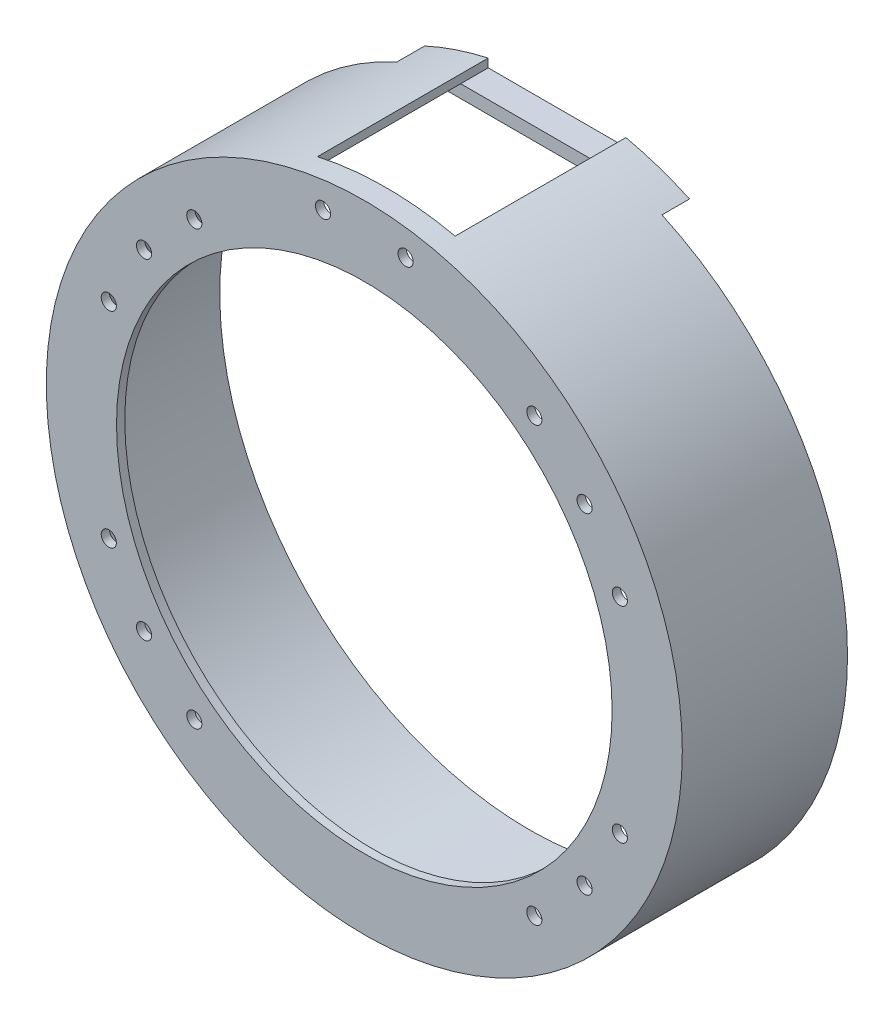
ISO-10303-21;
HEADER;
FILE_DESCRIPTION(('STEP AP214'),'2;1');
FILE_NAME('part.step','',(''),(''),'','','');
FILE_SCHEMA(('AUTOMOTIVE_DESIGN { 1 0 10303 214 1 1 1 1 }'));
ENDSEC;
DATA;
#1=APPLICATION_CONTEXT('core data for automotive mechanical design processes');
#2=APPLICATION_PROTOCOL_DEFINITION('international standard','automotive_design',2000,#1);
#3=PRODUCT_CONTEXT('',#1,'mechanical');
#4=PRODUCT('Part','Part','',(#3));
#5=PRODUCT_RELATED_PRODUCT_CATEGORY('part','',(#4));
#6=PRODUCT_DEFINITION_FORMATION('','',#4);
#7=PRODUCT_DEFINITION_CONTEXT('part definition',#1,'design');
#8=PRODUCT_DEFINITION('design','',#6,#7);
#9=PRODUCT_DEFINITION_SHAPE('','',#8);
#10=(LENGTH_UNIT() NAMED_UNIT(*) SI_UNIT(.MILLI.,.METRE.));
#11=(NAMED_UNIT(*) PLANE_ANGLE_UNIT() SI_UNIT($,.RADIAN.));
#12=(NAMED_UNIT(*) SI_UNIT($,.STERADIAN.) SOLID_ANGLE_UNIT());
#13=UNCERTAINTY_MEASURE_WITH_UNIT(LENGTH_MEASURE(1.E-05),#10,'distance_accuracy_value','');
#14=(GEOMETRIC_REPRESENTATION_CONTEXT(3) GLOBAL_UNCERTAINTY_ASSIGNED_CONTEXT((#13)) GLOBAL_UNIT_ASSIGNED_CONTEXT((#10,
#11,#12)) REPRESENTATION_CONTEXT('',''));
#15=CARTESIAN_POINT('',(0.,0.,0.));
#16=DIRECTION('',(0.,0.,1.));
#17=DIRECTION('',(1.,0.,0.));
#18=AXIS2_PLACEMENT_3D('',#15,#16,#17);
#19=CARTESIAN_POINT('',(0.,0.,-57.));
#20=DIRECTION('',(0.,0.,1.));
#21=DIRECTION('',(1.,0.,0.));
#22=AXIS2_PLACEMENT_3D('',#19,#20,#21);
#23=PLANE('',#22);
#24=DIRECTION('',(-1.,0.,0.));
#25=VECTOR('',#24,1.);
#26=CARTESIAN_POINT('',(48.1170447970364,105.,-57.));
#27=LINE('',#26,#25);
#28=CARTESIAN_POINT('',(48.1170447970364,105.,-57.));
#29=VERTEX_POINT('',#28);
#30=CARTESIAN_POINT('',(40.3887360535088,105.,-57.));
#31=VERTEX_POINT('',#30);
#32=EDGE_CURVE('E45',#29,#31,#27,.T.);
#33=ORIENTED_EDGE('',*,*,#32,.F.);
#34=CARTESIAN_POINT('',(0.,0.,-57.));
#35=DIRECTION('',(0.,0.,1.));
#36=DIRECTION('',(1.,0.,0.));
#37=AXIS2_PLACEMENT_3D('',#34,#35,#36);
#38=CIRCLE('',#37,115.5);
#39=CARTESIAN_POINT('',(-48.1170447970364,105.,-57.));
#40=VERTEX_POINT('',#39);
#41=EDGE_CURVE('E124',#40,#29,#38,.T.);
#42=ORIENTED_EDGE('',*,*,#41,.F.);
#43=CARTESIAN_POINT('',(-40.3887360535088,105.,-57.));
#44=VERTEX_POINT('',#43);
#45=EDGE_CURVE('E11',#44,#40,#27,.T.);
#46=ORIENTED_EDGE('',*,*,#45,.F.);
#47=CARTESIAN_POINT('',(0.,0.,-57.));
#48=DIRECTION('',(0.,0.,-1.));
#49=DIRECTION('',(1.,0.,0.));
#50=AXIS2_PLACEMENT_3D('',#47,#48,#49);
#51=CIRCLE('',#50,112.5);
#52=EDGE_CURVE('E186',#31,#44,#51,.T.);
#53=ORIENTED_EDGE('',*,*,#52,.F.);
#54=EDGE_LOOP('',(#33,#42,#46,#53));
#55=FACE_BOUND('',#54,.T.);
#56=ADVANCED_FACE('F35',(#55),#23,.F.);
#57=CARTESIAN_POINT('',(0.,0.,3.));
#58=DIRECTION('',(0.,0.,1.));
#59=DIRECTION('',(1.,0.,0.));
#60=AXIS2_PLACEMENT_3D('',#57,#58,#59);
#61=PLANE('',#60);
#62=CARTESIAN_POINT('',(0.,0.,3.));
#63=DIRECTION('',(0.,0.,1.));
#64=DIRECTION('',(1.,0.,0.));
#65=AXIS2_PLACEMENT_3D('',#62,#63,#64);
#66=CIRCLE('',#65,115.5);
#67=CARTESIAN_POINT('',(115.5,0.,3.));
#68=VERTEX_POINT('',#67);
#69=EDGE_CURVE('E190',#68,#68,#66,.T.);
#70=ORIENTED_EDGE('',*,*,#69,.T.);
#71=EDGE_LOOP('',(#70));
#72=FACE_BOUND('',#71,.T.);
#73=CARTESIAN_POINT('',(-92.8032088092834,-37.250025969145,3.));
#74=DIRECTION('',(0.,0.,1.));
#75=DIRECTION('',(1.,0.,0.));
#76=AXIS2_PLACEMENT_3D('',#73,#74,#75);
#77=CIRCLE('',#76,2.74999999999326);
#78=CARTESIAN_POINT('',(-90.0532088092902,-37.250025969145,3.));
#79=VERTEX_POINT('',#78);
#80=EDGE_CURVE('E152',#79,#79,#77,.T.);
#81=ORIENTED_EDGE('',*,*,#80,.F.);
#82=EDGE_LOOP('',(#81));
#83=FACE_BOUND('',#82,.T.);
#84=CARTESIAN_POINT('',(-61.7449233969724,-78.6610731855435,3.));
#85=DIRECTION('',(0.,0.,1.));
#86=DIRECTION('',(1.,0.,0.));
#87=AXIS2_PLACEMENT_3D('',#84,#85,#86);
#88=CIRCLE('',#87,2.75000000000269);
#89=CARTESIAN_POINT('',(-58.9949233969697,-78.6610731855435,3.));
#90=VERTEX_POINT('',#89);
#91=EDGE_CURVE('E156',#90,#90,#88,.T.);
#92=ORIENTED_EDGE('',*,*,#91,.F.);
#93=EDGE_LOOP('',(#92));
#94=FACE_BOUND('',#93,.T.);
#95=CARTESIAN_POINT('',(-61.7449233969724,78.6610731855435,3.));
#96=DIRECTION('',(0.,0.,1.));
#97=DIRECTION('',(-1.,0.,0.));
#98=AXIS2_PLACEMENT_3D('',#95,#96,#97);
#99=CIRCLE('',#98,2.75000000000269);
#100=CARTESIAN_POINT('',(-64.4949233969751,78.6610731855435,3.));
#101=VERTEX_POINT('',#100);
#102=EDGE_CURVE('E143',#101,#101,#99,.T.);
#103=ORIENTED_EDGE('',*,*,#102,.F.);
#104=EDGE_LOOP('',(#103));
#105=FACE_BOUND('',#104,.T.);
#106=CARTESIAN_POINT('',(-92.8032088092834,37.250025969145,3.));
#107=DIRECTION('',(0.,0.,1.));
#108=DIRECTION('',(-1.,0.,0.));
#109=AXIS2_PLACEMENT_3D('',#106,#107,#108);
#110=CIRCLE('',#109,2.74999999999326);
#111=CARTESIAN_POINT('',(-95.5532088092767,37.250025969145,3.));
#112=VERTEX_POINT('',#111);
#113=EDGE_CURVE('E140',#112,#112,#110,.T.);
#114=ORIENTED_EDGE('',*,*,#113,.F.);
#115=EDGE_LOOP('',(#114));
#116=FACE_BOUND('',#115,.T.);
#117=CARTESIAN_POINT('',(-80.,60.,3.));
#118=DIRECTION('',(0.,0.,1.));
#119=DIRECTION('',(-1.,0.,0.));
#120=AXIS2_PLACEMENT_3D('',#117,#118,#119);
#121=CIRCLE('',#120,2.75000000000001);
#122=CARTESIAN_POINT('',(-82.75,60.,3.));
#123=VERTEX_POINT('',#122);
#124=EDGE_CURVE('E144',#123,#123,#121,.T.);
#125=ORIENTED_EDGE('',*,*,#124,.F.);
#126=EDGE_LOOP('',(#125));
#127=FACE_BOUND('',#126,.T.);
#128=CARTESIAN_POINT('',(15.,105.,3.));
#129=DIRECTION('',(0.,0.,1.));
#130=DIRECTION('',(1.,0.,0.));
#131=AXIS2_PLACEMENT_3D('',#128,#129,#130);
#132=CIRCLE('',#131,2.75);
#133=CARTESIAN_POINT('',(17.75,105.,3.));
#134=VERTEX_POINT('',#133);
#135=EDGE_CURVE('E147',#134,#134,#132,.T.);
#136=ORIENTED_EDGE('',*,*,#135,.F.);
#137=EDGE_LOOP('',(#136));
#138=FACE_BOUND('',#137,.T.);
#139=CARTESIAN_POINT('',(-15.,105.,3.));
#140=DIRECTION('',(0.,0.,1.));
#141=DIRECTION('',(-1.,0.,0.));
#142=AXIS2_PLACEMENT_3D('',#139,#140,#141);
#143=CIRCLE('',#142,2.75);
#144=CARTESIAN_POINT('',(-17.75,105.,3.));
#145=VERTEX_POINT('',#144);
#146=EDGE_CURVE('E139',#145,#145,#143,.T.);
#147=ORIENTED_EDGE('',*,*,#146,.F.);
#148=EDGE_LOOP('',(#147));
#149=FACE_BOUND('',#148,.T.);
#150=CARTESIAN_POINT('',(61.7449233969724,-78.6610731855435,3.));
#151=DIRECTION('',(0.,0.,1.));
#152=DIRECTION('',(-1.,0.,0.));
#153=AXIS2_PLACEMENT_3D('',#150,#151,#152);
#154=CIRCLE('',#153,2.75000000000269);
#155=CARTESIAN_POINT('',(58.9949233969697,-78.6610731855435,3.));
#156=VERTEX_POINT('',#155);
#157=EDGE_CURVE('E170',#156,#156,#154,.T.);
#158=ORIENTED_EDGE('',*,*,#157,.F.);
#159=EDGE_LOOP('',(#158));
#160=FACE_BOUND('',#159,.T.);
#161=CARTESIAN_POINT('',(92.8032088092834,37.250025969145,3.));
#162=DIRECTION('',(0.,0.,1.));
#163=DIRECTION('',(1.,0.,0.));
#164=AXIS2_PLACEMENT_3D('',#161,#162,#163);
#165=CIRCLE('',#164,2.74999999999326);
#166=CARTESIAN_POINT('',(95.5532088092767,37.250025969145,3.));
#167=VERTEX_POINT('',#166);
#168=EDGE_CURVE('E174',#167,#167,#165,.T.);
#169=ORIENTED_EDGE('',*,*,#168,.F.);
#170=EDGE_LOOP('',(#169));
#171=FACE_BOUND('',#170,.T.);
#172=CARTESIAN_POINT('',(61.7449233969724,78.6610731855435,3.));
#173=DIRECTION('',(0.,0.,1.));
#174=DIRECTION('',(1.,0.,0.));
#175=AXIS2_PLACEMENT_3D('',#172,#173,#174);
#176=CIRCLE('',#175,2.75000000000269);
#177=CARTESIAN_POINT('',(64.4949233969751,78.6610731855435,3.));
#178=VERTEX_POINT('',#177);
#179=EDGE_CURVE('E164',#178,#178,#176,.T.);
#180=ORIENTED_EDGE('',*,*,#179,.F.);
#181=EDGE_LOOP('',(#180));
#182=FACE_BOUND('',#181,.T.);
#183=CARTESIAN_POINT('',(92.8032088092834,-37.250025969145,3.));
#184=DIRECTION('',(0.,0.,1.));
#185=DIRECTION('',(-1.,0.,0.));
#186=AXIS2_PLACEMENT_3D('',#183,#184,#185);
#187=CIRCLE('',#186,2.74999999999326);
#188=CARTESIAN_POINT('',(90.0532088092902,-37.250025969145,3.));
#189=VERTEX_POINT('',#188);
#190=EDGE_CURVE('E161',#189,#189,#187,.T.);
#191=ORIENTED_EDGE('',*,*,#190,.F.);
#192=EDGE_LOOP('',(#191));
#193=FACE_BOUND('',#192,.T.);
#194=CARTESIAN_POINT('',(80.,-60.,3.));
#195=DIRECTION('',(0.,0.,1.));
#196=DIRECTION('',(-1.,0.,0.));
#197=AXIS2_PLACEMENT_3D('',#194,#195,#196);
#198=CIRCLE('',#197,2.75000000000001);
#199=CARTESIAN_POINT('',(77.25,-60.,3.));
#200=VERTEX_POINT('',#199);
#201=EDGE_CURVE('E165',#200,#200,#198,.T.);
#202=ORIENTED_EDGE('',*,*,#201,.F.);
#203=EDGE_LOOP('',(#202));
#204=FACE_BOUND('',#203,.T.);
#205=CARTESIAN_POINT('',(-80.,-60.,3.));
#206=DIRECTION('',(0.,0.,1.));
#207=DIRECTION('',(1.,0.,0.));
#208=AXIS2_PLACEMENT_3D('',#205,#206,#207);
#209=CIRCLE('',#208,2.75000000000001);
#210=CARTESIAN_POINT('',(-77.25,-60.,3.));
#211=VERTEX_POINT('',#210);
#212=EDGE_CURVE('E155',#211,#211,#209,.T.);
#213=ORIENTED_EDGE('',*,*,#212,.F.);
#214=EDGE_LOOP('',(#213));
#215=FACE_BOUND('',#214,.T.);
#216=CARTESIAN_POINT('',(80.,60.,3.));
#217=DIRECTION('',(0.,0.,1.));
#218=DIRECTION('',(1.,0.,0.));
#219=AXIS2_PLACEMENT_3D('',#216,#217,#218);
#220=CIRCLE('',#219,2.75000000000001);
#221=CARTESIAN_POINT('',(82.75,60.,3.));
#222=VERTEX_POINT('',#221);
#223=EDGE_CURVE('E179',#222,#222,#220,.T.);
#224=ORIENTED_EDGE('',*,*,#223,.F.);
#225=EDGE_LOOP('',(#224));
#226=FACE_BOUND('',#225,.T.);
#227=CARTESIAN_POINT('',(0.,0.,3.));
#228=DIRECTION('',(0.,0.,1.));
#229=DIRECTION('',(1.,0.,0.));
#230=AXIS2_PLACEMENT_3D('',#227,#228,#229);
#231=CIRCLE('',#230,90.);
#232=CARTESIAN_POINT('',(90.,0.,3.));
#233=VERTEX_POINT('',#232);
#234=EDGE_CURVE('E202',#233,#233,#231,.T.);
#235=ORIENTED_EDGE('',*,*,#234,.F.);
#236=EDGE_LOOP('',(#235));
#237=FACE_BOUND('',#236,.T.);
#238=ADVANCED_FACE('F268',(#72,#83,#94,#105,#116,#127,#138,#149,#160,#171,#182,#193,#204,#215,
#226,#237),#61,.T.);
#239=CARTESIAN_POINT('',(0.,0.,0.));
#240=DIRECTION('',(0.,0.,1.));
#241=DIRECTION('',(1.,0.,0.));
#242=AXIS2_PLACEMENT_3D('',#239,#240,#241);
#243=PLANE('',#242);
#244=CARTESIAN_POINT('',(-92.8032088092834,-37.250025969145,0.));
#245=DIRECTION('',(0.,0.,1.));
#246=DIRECTION('',(1.,0.,0.));
#247=AXIS2_PLACEMENT_3D('',#244,#245,#246);
#248=CIRCLE('',#247,2.74999999999326);
#249=CARTESIAN_POINT('',(-90.0532088092902,-37.250025969145,0.));
#250=VERTEX_POINT('',#249);
#251=EDGE_CURVE('E183',#250,#250,#248,.T.);
#252=ORIENTED_EDGE('',*,*,#251,.T.);
#253=EDGE_LOOP('',(#252));
#254=FACE_BOUND('',#253,.T.);
#255=CARTESIAN_POINT('',(-61.7449233969724,-78.6610731855435,0.));
#256=DIRECTION('',(0.,0.,1.));
#257=DIRECTION('',(1.,0.,0.));
#258=AXIS2_PLACEMENT_3D('',#255,#256,#257);
#259=CIRCLE('',#258,2.75000000000269);
#260=CARTESIAN_POINT('',(-58.9949233969697,-78.6610731855435,0.));
#261=VERTEX_POINT('',#260);
#262=EDGE_CURVE('E244',#261,#261,#259,.T.);
#263=ORIENTED_EDGE('',*,*,#262,.T.);
#264=EDGE_LOOP('',(#263));
#265=FACE_BOUND('',#264,.T.);
#266=CARTESIAN_POINT('',(-61.7449233969724,78.6610731855435,0.));
#267=DIRECTION('',(0.,0.,1.));
#268=DIRECTION('',(1.,0.,0.));
#269=AXIS2_PLACEMENT_3D('',#266,#267,#268);
#270=CIRCLE('',#269,2.75000000000269);
#271=CARTESIAN_POINT('',(-58.9949233969697,78.6610731855435,0.));
#272=VERTEX_POINT('',#271);
#273=EDGE_CURVE('E241',#272,#272,#270,.T.);
#274=ORIENTED_EDGE('',*,*,#273,.T.);
#275=EDGE_LOOP('',(#274));
#276=FACE_BOUND('',#275,.T.);
#277=CARTESIAN_POINT('',(-92.8032088092834,37.250025969145,0.));
#278=DIRECTION('',(0.,0.,1.));
#279=DIRECTION('',(1.,0.,0.));
#280=AXIS2_PLACEMENT_3D('',#277,#278,#279);
#281=CIRCLE('',#280,2.74999999999326);
#282=CARTESIAN_POINT('',(-90.0532088092902,37.250025969145,0.));
#283=VERTEX_POINT('',#282);
#284=EDGE_CURVE('E238',#283,#283,#281,.T.);
#285=ORIENTED_EDGE('',*,*,#284,.T.);
#286=EDGE_LOOP('',(#285));
#287=FACE_BOUND('',#286,.T.);
#288=CARTESIAN_POINT('',(-80.,60.,0.));
#289=DIRECTION('',(0.,0.,1.));
#290=DIRECTION('',(1.,0.,0.));
#291=AXIS2_PLACEMENT_3D('',#288,#289,#290);
#292=CIRCLE('',#291,2.75000000000001);
#293=CARTESIAN_POINT('',(-77.25,60.,0.));
#294=VERTEX_POINT('',#293);
#295=EDGE_CURVE('E235',#294,#294,#292,.T.);
#296=ORIENTED_EDGE('',*,*,#295,.T.);
#297=EDGE_LOOP('',(#296));
#298=FACE_BOUND('',#297,.T.);
#299=CARTESIAN_POINT('',(15.,105.,0.));
#300=DIRECTION('',(0.,0.,1.));
#301=DIRECTION('',(1.,0.,0.));
#302=AXIS2_PLACEMENT_3D('',#299,#300,#301);
#303=CIRCLE('',#302,2.75);
#304=CARTESIAN_POINT('',(17.75,105.,0.));
#305=VERTEX_POINT('',#304);
#306=EDGE_CURVE('E232',#305,#305,#303,.T.);
#307=ORIENTED_EDGE('',*,*,#306,.T.);
#308=EDGE_LOOP('',(#307));
#309=FACE_BOUND('',#308,.T.);
#310=CARTESIAN_POINT('',(-15.,105.,0.));
#311=DIRECTION('',(0.,0.,1.));
#312=DIRECTION('',(1.,0.,0.));
#313=AXIS2_PLACEMENT_3D('',#310,#311,#312);
#314=CIRCLE('',#313,2.75);
#315=CARTESIAN_POINT('',(-12.25,105.,0.));
#316=VERTEX_POINT('',#315);
#317=EDGE_CURVE('E229',#316,#316,#314,.T.);
#318=ORIENTED_EDGE('',*,*,#317,.T.);
#319=EDGE_LOOP('',(#318));
#320=FACE_BOUND('',#319,.T.);
#321=CARTESIAN_POINT('',(61.7449233969724,-78.6610731855435,0.));
#322=DIRECTION('',(0.,0.,1.));
#323=DIRECTION('',(1.,0.,0.));
#324=AXIS2_PLACEMENT_3D('',#321,#322,#323);
#325=CIRCLE('',#324,2.75000000000269);
#326=CARTESIAN_POINT('',(64.4949233969751,-78.6610731855435,0.));
#327=VERTEX_POINT('',#326);
#328=EDGE_CURVE('E226',#327,#327,#325,.T.);
#329=ORIENTED_EDGE('',*,*,#328,.T.);
#330=EDGE_LOOP('',(#329));
#331=FACE_BOUND('',#330,.T.);
#332=CARTESIAN_POINT('',(92.8032088092834,37.250025969145,0.));
#333=DIRECTION('',(0.,0.,1.));
#334=DIRECTION('',(1.,0.,0.));
#335=AXIS2_PLACEMENT_3D('',#332,#333,#334);
#336=CIRCLE('',#335,2.74999999999326);
#337=CARTESIAN_POINT('',(95.5532088092767,37.250025969145,0.));
#338=VERTEX_POINT('',#337);
#339=EDGE_CURVE('E223',#338,#338,#336,.T.);
#340=ORIENTED_EDGE('',*,*,#339,.T.);
#341=EDGE_LOOP('',(#340));
#342=FACE_BOUND('',#341,.T.);
#343=CARTESIAN_POINT('',(61.7449233969724,78.6610731855435,0.));
#344=DIRECTION('',(0.,0.,1.));
#345=DIRECTION('',(1.,0.,0.));
#346=AXIS2_PLACEMENT_3D('',#343,#344,#345);
#347=CIRCLE('',#346,2.75000000000269);
#348=CARTESIAN_POINT('',(64.4949233969751,78.6610731855435,0.));
#349=VERTEX_POINT('',#348);
#350=EDGE_CURVE('E220',#349,#349,#347,.T.);
#351=ORIENTED_EDGE('',*,*,#350,.T.);
#352=EDGE_LOOP('',(#351));
#353=FACE_BOUND('',#352,.T.);
#354=CARTESIAN_POINT('',(92.8032088092834,-37.250025969145,0.));
#355=DIRECTION('',(0.,0.,1.));
#356=DIRECTION('',(1.,0.,0.));
#357=AXIS2_PLACEMENT_3D('',#354,#355,#356);
#358=CIRCLE('',#357,2.74999999999326);
#359=CARTESIAN_POINT('',(95.5532088092767,-37.250025969145,0.));
#360=VERTEX_POINT('',#359);
#361=EDGE_CURVE('E217',#360,#360,#358,.T.);
#362=ORIENTED_EDGE('',*,*,#361,.T.);
#363=EDGE_LOOP('',(#362));
#364=FACE_BOUND('',#363,.T.);
#365=CARTESIAN_POINT('',(80.,-60.,0.));
#366=DIRECTION('',(0.,0.,1.));
#367=DIRECTION('',(1.,0.,0.));
#368=AXIS2_PLACEMENT_3D('',#365,#366,#367);
#369=CIRCLE('',#368,2.75000000000001);
#370=CARTESIAN_POINT('',(82.75,-60.,0.));
#371=VERTEX_POINT('',#370);
#372=EDGE_CURVE('E214',#371,#371,#369,.T.);
#373=ORIENTED_EDGE('',*,*,#372,.T.);
#374=EDGE_LOOP('',(#373));
#375=FACE_BOUND('',#374,.T.);
#376=CARTESIAN_POINT('',(-80.,-60.,0.));
#377=DIRECTION('',(0.,0.,1.));
#378=DIRECTION('',(1.,0.,0.));
#379=AXIS2_PLACEMENT_3D('',#376,#377,#378);
#380=CIRCLE('',#379,2.75000000000001);
#381=CARTESIAN_POINT('',(-77.25,-60.,0.));
#382=VERTEX_POINT('',#381);
#383=EDGE_CURVE('E173',#382,#382,#380,.T.);
#384=ORIENTED_EDGE('',*,*,#383,.T.);
#385=EDGE_LOOP('',(#384));
#386=FACE_BOUND('',#385,.T.);
#387=CARTESIAN_POINT('',(80.,60.,0.));
#388=DIRECTION('',(0.,0.,1.));
#389=DIRECTION('',(1.,0.,0.));
#390=AXIS2_PLACEMENT_3D('',#387,#388,#389);
#391=CIRCLE('',#390,2.75000000000001);
#392=CARTESIAN_POINT('',(82.75,60.,0.));
#393=VERTEX_POINT('',#392);
#394=EDGE_CURVE('E182',#393,#393,#391,.T.);
#395=ORIENTED_EDGE('',*,*,#394,.T.);
#396=EDGE_LOOP('',(#395));
#397=FACE_BOUND('',#396,.T.);
#398=CARTESIAN_POINT('',(0.,0.,0.));
#399=DIRECTION('',(0.,0.,1.));
#400=DIRECTION('',(1.,0.,0.));
#401=AXIS2_PLACEMENT_3D('',#398,#399,#400);
#402=CIRCLE('',#401,112.5);
#403=CARTESIAN_POINT('',(112.5,0.,0.));
#404=VERTEX_POINT('',#403);
#405=EDGE_CURVE('E205',#404,#404,#402,.T.);
#406=ORIENTED_EDGE('',*,*,#405,.F.);
#407=EDGE_LOOP('',(#406));
#408=FACE_BOUND('',#407,.T.);
#409=CARTESIAN_POINT('',(0.,0.,0.));
#410=DIRECTION('',(0.,0.,1.));
#411=DIRECTION('',(1.,0.,0.));
#412=AXIS2_PLACEMENT_3D('',#409,#410,#411);
#413=CIRCLE('',#412,90.);
#414=CARTESIAN_POINT('',(90.,0.,0.));
#415=VERTEX_POINT('',#414);
#416=EDGE_CURVE('E195',#415,#415,#413,.T.);
#417=ORIENTED_EDGE('',*,*,#416,.T.);
#418=EDGE_LOOP('',(#417));
#419=FACE_BOUND('',#418,.T.);
#420=ADVANCED_FACE('F37',(#254,#265,#276,#287,#298,#309,#320,#331,#342,#353,#364,#375,#386,#397,
#408,#419),#243,.F.);
#421=CARTESIAN_POINT('',(0.,0.,3.));
#422=DIRECTION('',(0.,0.,-1.));
#423=DIRECTION('',(-1.,0.,0.));
#424=AXIS2_PLACEMENT_3D('',#421,#422,#423);
#425=CYLINDRICAL_SURFACE('',#424,90.);
#426=ORIENTED_EDGE('',*,*,#234,.T.);
#427=EDGE_LOOP('',(#426));
#428=FACE_BOUND('',#427,.T.);
#429=ORIENTED_EDGE('',*,*,#416,.F.);
#430=EDGE_LOOP('',(#429));
#431=FACE_BOUND('',#430,.T.);
#432=ADVANCED_FACE('F291',(#428,#431),#425,.F.);
#433=CARTESIAN_POINT('',(0.,0.,-57.));
#434=DIRECTION('',(0.,0.,1.));
#435=DIRECTION('',(1.,0.,0.));
#436=AXIS2_PLACEMENT_3D('',#433,#434,#435);
#437=CYLINDRICAL_SURFACE('',#436,112.5);
#438=DIRECTION('',(0.,0.,1.));
#439=VECTOR('',#438,1.);
#440=CARTESIAN_POINT('',(-25.,109.687054842402,-57.));
#441=LINE('',#440,#439);
#442=CARTESIAN_POINT('',(-25.,109.687054842402,-57.));
#443=VERTEX_POINT('',#442);
#444=CARTESIAN_POINT('',(-25.,109.687054842402,-5.));
#445=VERTEX_POINT('',#444);
#446=EDGE_CURVE('E189',#443,#445,#441,.T.);
#447=ORIENTED_EDGE('',*,*,#446,.T.);
#448=CARTESIAN_POINT('',(0.,0.,-5.));
#449=DIRECTION('',(0.,0.,-1.));
#450=DIRECTION('',(-1.,0.,0.));
#451=AXIS2_PLACEMENT_3D('',#448,#449,#450);
#452=CIRCLE('',#451,112.5);
#453=CARTESIAN_POINT('',(25.,109.687054842402,-5.));
#454=VERTEX_POINT('',#453);
#455=EDGE_CURVE('E125',#445,#454,#452,.T.);
#456=ORIENTED_EDGE('',*,*,#455,.T.);
#457=DIRECTION('',(0.,0.,1.));
#458=VECTOR('',#457,1.);
#459=CARTESIAN_POINT('',(25.,109.687054842402,-57.));
#460=LINE('',#459,#458);
#461=CARTESIAN_POINT('',(25.,109.687054842402,-57.));
#462=VERTEX_POINT('',#461);
#463=EDGE_CURVE('E193',#462,#454,#460,.T.);
#464=ORIENTED_EDGE('',*,*,#463,.F.);
#465=EDGE_CURVE('E184',#462,#31,#51,.T.);
#466=ORIENTED_EDGE('',*,*,#465,.T.);
#467=ORIENTED_EDGE('',*,*,#52,.T.);
#468=EDGE_CURVE('E187',#44,#443,#51,.T.);
#469=ORIENTED_EDGE('',*,*,#468,.T.);
#470=EDGE_LOOP('',(#447,#456,#464,#466,#467,#469));
#471=FACE_BOUND('',#470,.T.);
#472=ORIENTED_EDGE('',*,*,#405,.T.);
#473=EDGE_LOOP('',(#472));
#474=FACE_BOUND('',#473,.T.);
#475=ADVANCED_FACE('F281',(#471,#474),#437,.F.);
#476=CARTESIAN_POINT('',(25.,109.687054842402,-57.));
#477=DIRECTION('',(-1.,0.,0.));
#478=DIRECTION('',(0.,-1.,0.));
#479=AXIS2_PLACEMENT_3D('',#476,#477,#478);
#480=PLANE('',#479);
#481=DIRECTION('',(0.,-1.,0.));
#482=VECTOR('',#481,1.);
#483=CARTESIAN_POINT('',(25.,109.687054842402,-5.));
#484=LINE('',#483,#482);
#485=CARTESIAN_POINT('',(25.,112.761917330276,-5.));
#486=VERTEX_POINT('',#485);
#487=EDGE_CURVE('E136',#486,#454,#484,.T.);
#488=ORIENTED_EDGE('',*,*,#487,.F.);
#489=DIRECTION('',(0.,0.,1.));
#490=VECTOR('',#489,1.);
#491=CARTESIAN_POINT('',(25.,112.761917330276,-57.));
#492=LINE('',#491,#490);
#493=CARTESIAN_POINT('',(25.,112.761917330276,-67.));
#494=VERTEX_POINT('',#493);
#495=EDGE_CURVE('E196',#494,#486,#492,.T.);
#496=ORIENTED_EDGE('',*,*,#495,.F.);
#497=DIRECTION('',(0.,1.,0.));
#498=VECTOR('',#497,1.);
#499=CARTESIAN_POINT('',(25.,112.761917330276,-67.));
#500=LINE('',#499,#498);
#501=CARTESIAN_POINT('',(25.,109.687054842402,-67.));
#502=VERTEX_POINT('',#501);
#503=EDGE_CURVE('E117',#502,#494,#500,.T.);
#504=ORIENTED_EDGE('',*,*,#503,.F.);
#505=DIRECTION('',(0.,0.,1.));
#506=VECTOR('',#505,1.);
#507=CARTESIAN_POINT('',(25.,109.687054842402,-67.));
#508=LINE('',#507,#506);
#509=EDGE_CURVE('E546',#502,#462,#508,.T.);
#510=ORIENTED_EDGE('',*,*,#509,.T.);
#511=ORIENTED_EDGE('',*,*,#463,.T.);
#512=EDGE_LOOP('',(#488,#496,#504,#510,#511));
#513=FACE_BOUND('',#512,.T.);
#514=ADVANCED_FACE('F278',(#513),#480,.T.);
#515=CARTESIAN_POINT('',(0.,0.,-57.));
#516=DIRECTION('',(0.,0.,1.));
#517=DIRECTION('',(1.,0.,0.));
#518=AXIS2_PLACEMENT_3D('',#515,#516,#517);
#519=CYLINDRICAL_SURFACE('',#518,115.5);
#520=ORIENTED_EDGE('',*,*,#495,.T.);
#521=CARTESIAN_POINT('',(0.,0.,-5.));
#522=DIRECTION('',(0.,0.,-1.));
#523=DIRECTION('',(-1.,0.,0.));
#524=AXIS2_PLACEMENT_3D('',#521,#522,#523);
#525=CIRCLE('',#524,115.5);
#526=CARTESIAN_POINT('',(-25.,112.761917330276,-5.));
#527=VERTEX_POINT('',#526);
#528=EDGE_CURVE('E128',#527,#486,#525,.T.);
#529=ORIENTED_EDGE('',*,*,#528,.F.);
#530=DIRECTION('',(0.,0.,1.));
#531=VECTOR('',#530,1.);
#532=CARTESIAN_POINT('',(-25.,112.761917330276,-57.));
#533=LINE('',#532,#531);
#534=CARTESIAN_POINT('',(-25.,112.761917330276,-67.));
#535=VERTEX_POINT('',#534);
#536=EDGE_CURVE('E198',#535,#527,#533,.T.);
#537=ORIENTED_EDGE('',*,*,#536,.F.);
#538=CARTESIAN_POINT('',(0.,0.,-67.));
#539=DIRECTION('',(0.,0.,-1.));
#540=DIRECTION('',(-1.,0.,0.));
#541=AXIS2_PLACEMENT_3D('',#538,#539,#540);
#542=CIRCLE('',#541,115.5);
#543=CARTESIAN_POINT('',(-48.1170447970364,105.,-67.));
#544=VERTEX_POINT('',#543);
#545=EDGE_CURVE('E110',#544,#535,#542,.T.);
#546=ORIENTED_EDGE('',*,*,#545,.F.);
#547=DIRECTION('',(0.,0.,1.));
#548=VECTOR('',#547,1.);
#549=CARTESIAN_POINT('',(-48.1170447970364,105.,-67.));
#550=LINE('',#549,#548);
#551=EDGE_CURVE('E106',#544,#40,#550,.T.);
#552=ORIENTED_EDGE('',*,*,#551,.T.);
#553=ORIENTED_EDGE('',*,*,#41,.T.);
#554=DIRECTION('',(0.,0.,1.));
#555=VECTOR('',#554,1.);
#556=CARTESIAN_POINT('',(48.1170447970364,105.,-67.));
#557=LINE('',#556,#555);
#558=CARTESIAN_POINT('',(48.1170447970364,105.,-67.));
#559=VERTEX_POINT('',#558);
#560=EDGE_CURVE('E104',#559,#29,#557,.T.);
#561=ORIENTED_EDGE('',*,*,#560,.F.);
#562=CARTESIAN_POINT('',(0.,0.,-67.));
#563=DIRECTION('',(0.,0.,-1.));
#564=DIRECTION('',(-1.,0.,0.));
#565=AXIS2_PLACEMENT_3D('',#562,#563,#564);
#566=CIRCLE('',#565,115.5);
#567=EDGE_CURVE('E111',#494,#559,#566,.T.);
#568=ORIENTED_EDGE('',*,*,#567,.F.);
#569=EDGE_LOOP('',(#520,#529,#537,#546,#552,#553,#561,#568));
#570=FACE_BOUND('',#569,.T.);
#571=ORIENTED_EDGE('',*,*,#69,.F.);
#572=EDGE_LOOP('',(#571));
#573=FACE_BOUND('',#572,.T.);
#574=ADVANCED_FACE('F122',(#570,#573),#519,.T.);
#575=CARTESIAN_POINT('',(-25.,109.687054842402,-57.));
#576=DIRECTION('',(1.,0.,0.));
#577=DIRECTION('',(0.,0.,-1.));
#578=AXIS2_PLACEMENT_3D('',#575,#576,#577);
#579=PLANE('',#578);
#580=DIRECTION('',(0.,1.,0.));
#581=VECTOR('',#580,1.);
#582=CARTESIAN_POINT('',(-25.,109.687054842402,-5.));
#583=LINE('',#582,#581);
#584=EDGE_CURVE('E39',#445,#527,#583,.T.);
#585=ORIENTED_EDGE('',*,*,#584,.F.);
#586=ORIENTED_EDGE('',*,*,#446,.F.);
#587=DIRECTION('',(0.,0.,1.));
#588=VECTOR('',#587,1.);
#589=CARTESIAN_POINT('',(-25.,109.687054842402,-67.));
#590=LINE('',#589,#588);
#591=CARTESIAN_POINT('',(-25.,109.687054842402,-67.));
#592=VERTEX_POINT('',#591);
#593=EDGE_CURVE('E130',#592,#443,#590,.T.);
#594=ORIENTED_EDGE('',*,*,#593,.F.);
#595=DIRECTION('',(0.,-1.,0.));
#596=VECTOR('',#595,1.);
#597=CARTESIAN_POINT('',(-25.,112.761917330276,-67.));
#598=LINE('',#597,#596);
#599=EDGE_CURVE('E554',#535,#592,#598,.T.);
#600=ORIENTED_EDGE('',*,*,#599,.F.);
#601=ORIENTED_EDGE('',*,*,#536,.T.);
#602=EDGE_LOOP('',(#585,#586,#594,#600,#601));
#603=FACE_BOUND('',#602,.T.);
#604=ADVANCED_FACE('F285',(#603),#579,.T.);
#605=CARTESIAN_POINT('',(80.,60.,-7.));
#606=DIRECTION('',(0.,0.,1.));
#607=DIRECTION('',(1.,0.,0.));
#608=AXIS2_PLACEMENT_3D('',#605,#606,#607);
#609=CYLINDRICAL_SURFACE('',#608,2.75000000000001);
#610=ORIENTED_EDGE('',*,*,#223,.T.);
#611=EDGE_LOOP('',(#610));
#612=FACE_BOUND('',#611,.T.);
#613=ORIENTED_EDGE('',*,*,#394,.F.);
#614=EDGE_LOOP('',(#613));
#615=FACE_BOUND('',#614,.T.);
#616=ADVANCED_FACE('F276',(#612,#615),#609,.F.);
#617=CARTESIAN_POINT('',(-80.,-60.,-7.));
#618=DIRECTION('',(0.,0.,1.));
#619=DIRECTION('',(1.,0.,0.));
#620=AXIS2_PLACEMENT_3D('',#617,#618,#619);
#621=CYLINDRICAL_SURFACE('',#620,2.75000000000001);
#622=ORIENTED_EDGE('',*,*,#212,.T.);
#623=EDGE_LOOP('',(#622));
#624=FACE_BOUND('',#623,.T.);
#625=ORIENTED_EDGE('',*,*,#383,.F.);
#626=EDGE_LOOP('',(#625));
#627=FACE_BOUND('',#626,.T.);
#628=ADVANCED_FACE('F419',(#624,#627),#621,.F.);
#629=CARTESIAN_POINT('',(80.,-60.,-7.));
#630=DIRECTION('',(0.,0.,1.));
#631=DIRECTION('',(1.,0.,0.));
#632=AXIS2_PLACEMENT_3D('',#629,#630,#631);
#633=CYLINDRICAL_SURFACE('',#632,2.75000000000001);
#634=ORIENTED_EDGE('',*,*,#201,.T.);
#635=EDGE_LOOP('',(#634));
#636=FACE_BOUND('',#635,.T.);
#637=ORIENTED_EDGE('',*,*,#372,.F.);
#638=EDGE_LOOP('',(#637));
#639=FACE_BOUND('',#638,.T.);
#640=ADVANCED_FACE('F409',(#636,#639),#633,.F.);
#641=CARTESIAN_POINT('',(92.8032088092834,-37.250025969145,-7.));
#642=DIRECTION('',(0.,0.,1.));
#643=DIRECTION('',(1.,0.,0.));
#644=AXIS2_PLACEMENT_3D('',#641,#642,#643);
#645=CYLINDRICAL_SURFACE('',#644,2.74999999999326);
#646=ORIENTED_EDGE('',*,*,#190,.T.);
#647=EDGE_LOOP('',(#646));
#648=FACE_BOUND('',#647,.T.);
#649=ORIENTED_EDGE('',*,*,#361,.F.);
#650=EDGE_LOOP('',(#649));
#651=FACE_BOUND('',#650,.T.);
#652=ADVANCED_FACE('F400',(#648,#651),#645,.F.);
#653=CARTESIAN_POINT('',(61.7449233969724,78.6610731855435,-7.));
#654=DIRECTION('',(0.,0.,1.));
#655=DIRECTION('',(1.,0.,0.));
#656=AXIS2_PLACEMENT_3D('',#653,#654,#655);
#657=CYLINDRICAL_SURFACE('',#656,2.75000000000269);
#658=ORIENTED_EDGE('',*,*,#179,.T.);
#659=EDGE_LOOP('',(#658));
#660=FACE_BOUND('',#659,.T.);
#661=ORIENTED_EDGE('',*,*,#350,.F.);
#662=EDGE_LOOP('',(#661));
#663=FACE_BOUND('',#662,.T.);
#664=ADVANCED_FACE('F390',(#660,#663),#657,.F.);
#665=CARTESIAN_POINT('',(92.8032088092834,37.250025969145,-7.));
#666=DIRECTION('',(0.,0.,1.));
#667=DIRECTION('',(1.,0.,0.));
#668=AXIS2_PLACEMENT_3D('',#665,#666,#667);
#669=CYLINDRICAL_SURFACE('',#668,2.74999999999326);
#670=ORIENTED_EDGE('',*,*,#168,.T.);
#671=EDGE_LOOP('',(#670));
#672=FACE_BOUND('',#671,.T.);
#673=ORIENTED_EDGE('',*,*,#339,.F.);
#674=EDGE_LOOP('',(#673));
#675=FACE_BOUND('',#674,.T.);
#676=ADVANCED_FACE('F380',(#672,#675),#669,.F.);
#677=CARTESIAN_POINT('',(61.7449233969724,-78.6610731855435,-7.));
#678=DIRECTION('',(0.,0.,1.));
#679=DIRECTION('',(1.,0.,0.));
#680=AXIS2_PLACEMENT_3D('',#677,#678,#679);
#681=CYLINDRICAL_SURFACE('',#680,2.75000000000269);
#682=ORIENTED_EDGE('',*,*,#157,.T.);
#683=EDGE_LOOP('',(#682));
#684=FACE_BOUND('',#683,.T.);
#685=ORIENTED_EDGE('',*,*,#328,.F.);
#686=EDGE_LOOP('',(#685));
#687=FACE_BOUND('',#686,.T.);
#688=ADVANCED_FACE('F371',(#684,#687),#681,.F.);
#689=CARTESIAN_POINT('',(-15.,105.,-7.));
#690=DIRECTION('',(0.,0.,1.));
#691=DIRECTION('',(1.,0.,0.));
#692=AXIS2_PLACEMENT_3D('',#689,#690,#691);
#693=CYLINDRICAL_SURFACE('',#692,2.75);
#694=ORIENTED_EDGE('',*,*,#146,.T.);
#695=EDGE_LOOP('',(#694));
#696=FACE_BOUND('',#695,.T.);
#697=ORIENTED_EDGE('',*,*,#317,.F.);
#698=EDGE_LOOP('',(#697));
#699=FACE_BOUND('',#698,.T.);
#700=ADVANCED_FACE('F361',(#696,#699),#693,.F.);
#701=CARTESIAN_POINT('',(15.,105.,-7.));
#702=DIRECTION('',(0.,0.,1.));
#703=DIRECTION('',(1.,0.,0.));
#704=AXIS2_PLACEMENT_3D('',#701,#702,#703);
#705=CYLINDRICAL_SURFACE('',#704,2.75);
#706=ORIENTED_EDGE('',*,*,#135,.T.);
#707=EDGE_LOOP('',(#706));
#708=FACE_BOUND('',#707,.T.);
#709=ORIENTED_EDGE('',*,*,#306,.F.);
#710=EDGE_LOOP('',(#709));
#711=FACE_BOUND('',#710,.T.);
#712=ADVANCED_FACE('F351',(#708,#711),#705,.F.);
#713=CARTESIAN_POINT('',(-80.,60.,-7.));
#714=DIRECTION('',(0.,0.,1.));
#715=DIRECTION('',(1.,0.,0.));
#716=AXIS2_PLACEMENT_3D('',#713,#714,#715);
#717=CYLINDRICAL_SURFACE('',#716,2.75000000000001);
#718=ORIENTED_EDGE('',*,*,#124,.T.);
#719=EDGE_LOOP('',(#718));
#720=FACE_BOUND('',#719,.T.);
#721=ORIENTED_EDGE('',*,*,#295,.F.);
#722=EDGE_LOOP('',(#721));
#723=FACE_BOUND('',#722,.T.);
#724=ADVANCED_FACE('F341',(#720,#723),#717,.F.);
#725=CARTESIAN_POINT('',(-92.8032088092834,37.250025969145,-7.));
#726=DIRECTION('',(0.,0.,1.));
#727=DIRECTION('',(1.,0.,0.));
#728=AXIS2_PLACEMENT_3D('',#725,#726,#727);
#729=CYLINDRICAL_SURFACE('',#728,2.74999999999326);
#730=ORIENTED_EDGE('',*,*,#113,.T.);
#731=EDGE_LOOP('',(#730));
#732=FACE_BOUND('',#731,.T.);
#733=ORIENTED_EDGE('',*,*,#284,.F.);
#734=EDGE_LOOP('',(#733));
#735=FACE_BOUND('',#734,.T.);
#736=ADVANCED_FACE('F331',(#732,#735),#729,.F.);
#737=CARTESIAN_POINT('',(-61.7449233969724,78.6610731855435,-7.));
#738=DIRECTION('',(0.,0.,1.));
#739=DIRECTION('',(1.,0.,0.));
#740=AXIS2_PLACEMENT_3D('',#737,#738,#739);
#741=CYLINDRICAL_SURFACE('',#740,2.75000000000269);
#742=ORIENTED_EDGE('',*,*,#102,.T.);
#743=EDGE_LOOP('',(#742));
#744=FACE_BOUND('',#743,.T.);
#745=ORIENTED_EDGE('',*,*,#273,.F.);
#746=EDGE_LOOP('',(#745));
#747=FACE_BOUND('',#746,.T.);
#748=ADVANCED_FACE('F263',(#744,#747),#741,.F.);
#749=CARTESIAN_POINT('',(-61.7449233969724,-78.6610731855435,-7.));
#750=DIRECTION('',(0.,0.,1.));
#751=DIRECTION('',(1.,0.,0.));
#752=AXIS2_PLACEMENT_3D('',#749,#750,#751);
#753=CYLINDRICAL_SURFACE('',#752,2.75000000000269);
#754=ORIENTED_EDGE('',*,*,#91,.T.);
#755=EDGE_LOOP('',(#754));
#756=FACE_BOUND('',#755,.T.);
#757=ORIENTED_EDGE('',*,*,#262,.F.);
#758=EDGE_LOOP('',(#757));
#759=FACE_BOUND('',#758,.T.);
#760=ADVANCED_FACE('F254',(#756,#759),#753,.F.);
#761=CARTESIAN_POINT('',(-92.8032088092834,-37.250025969145,-7.));
#762=DIRECTION('',(0.,0.,1.));
#763=DIRECTION('',(1.,0.,0.));
#764=AXIS2_PLACEMENT_3D('',#761,#762,#763);
#765=CYLINDRICAL_SURFACE('',#764,2.74999999999326);
#766=ORIENTED_EDGE('',*,*,#80,.T.);
#767=EDGE_LOOP('',(#766));
#768=FACE_BOUND('',#767,.T.);
#769=ORIENTED_EDGE('',*,*,#251,.F.);
#770=EDGE_LOOP('',(#769));
#771=FACE_BOUND('',#770,.T.);
#772=ADVANCED_FACE('F251',(#768,#771),#765,.F.);
#773=CARTESIAN_POINT('',(0.,0.,-5.));
#774=DIRECTION('',(0.,0.,-1.));
#775=DIRECTION('',(-1.,0.,0.));
#776=AXIS2_PLACEMENT_3D('',#773,#774,#775);
#777=PLANE('',#776);
#778=ORIENTED_EDGE('',*,*,#528,.T.);
#779=ORIENTED_EDGE('',*,*,#487,.T.);
#780=ORIENTED_EDGE('',*,*,#455,.F.);
#781=ORIENTED_EDGE('',*,*,#584,.T.);
#782=EDGE_LOOP('',(#778,#779,#780,#781));
#783=FACE_BOUND('',#782,.T.);
#784=ADVANCED_FACE('F253',(#783),#777,.T.);
#785=CARTESIAN_POINT('',(48.1170447970364,105.,-67.));
#786=DIRECTION('',(0.,1.,0.));
#787=DIRECTION('',(0.,0.,1.));
#788=AXIS2_PLACEMENT_3D('',#785,#786,#787);
#789=PLANE('',#788);
#790=ORIENTED_EDGE('',*,*,#32,.T.);
#791=EDGE_CURVE('E46',#31,#44,#27,.T.);
#792=ORIENTED_EDGE('',*,*,#791,.T.);
#793=ORIENTED_EDGE('',*,*,#45,.T.);
#794=ORIENTED_EDGE('',*,*,#551,.F.);
#795=DIRECTION('',(-1.,0.,0.));
#796=VECTOR('',#795,1.);
#797=CARTESIAN_POINT('',(48.1170447970364,105.,-67.));
#798=LINE('',#797,#796);
#799=EDGE_CURVE('E100',#559,#544,#798,.T.);
#800=ORIENTED_EDGE('',*,*,#799,.F.);
#801=ORIENTED_EDGE('',*,*,#560,.T.);
#802=EDGE_LOOP('',(#790,#792,#793,#794,#800,#801));
#803=FACE_BOUND('',#802,.T.);
#804=ADVANCED_FACE('F102',(#803),#789,.F.);
#805=CARTESIAN_POINT('',(25.,109.687054842402,-67.));
#806=DIRECTION('',(0.,-1.,0.));
#807=DIRECTION('',(1.,0.,0.));
#808=AXIS2_PLACEMENT_3D('',#805,#806,#807);
#809=PLANE('',#808);
#810=DIRECTION('',(1.,0.,0.));
#811=VECTOR('',#810,1.);
#812=CARTESIAN_POINT('',(25.,109.687054842402,-57.));
#813=LINE('',#812,#811);
#814=EDGE_CURVE('E120',#443,#462,#813,.T.);
#815=ORIENTED_EDGE('',*,*,#814,.T.);
#816=ORIENTED_EDGE('',*,*,#509,.F.);
#817=DIRECTION('',(1.,0.,0.));
#818=VECTOR('',#817,1.);
#819=CARTESIAN_POINT('',(25.,109.687054842402,-67.));
#820=LINE('',#819,#818);
#821=EDGE_CURVE('E550',#592,#502,#820,.T.);
#822=ORIENTED_EDGE('',*,*,#821,.F.);
#823=ORIENTED_EDGE('',*,*,#593,.T.);
#824=EDGE_LOOP('',(#815,#816,#822,#823));
#825=FACE_BOUND('',#824,.T.);
#826=ADVANCED_FACE('F492',(#825),#809,.F.);
#827=CARTESIAN_POINT('',(0.,0.,-67.));
#828=DIRECTION('',(0.,0.,-1.));
#829=DIRECTION('',(-1.,0.,0.));
#830=AXIS2_PLACEMENT_3D('',#827,#828,#829);
#831=PLANE('',#830);
#832=ORIENTED_EDGE('',*,*,#567,.T.);
#833=ORIENTED_EDGE('',*,*,#799,.T.);
#834=ORIENTED_EDGE('',*,*,#545,.T.);
#835=ORIENTED_EDGE('',*,*,#599,.T.);
#836=ORIENTED_EDGE('',*,*,#821,.T.);
#837=ORIENTED_EDGE('',*,*,#503,.T.);
#838=EDGE_LOOP('',(#832,#833,#834,#835,#836,#837));
#839=FACE_BOUND('',#838,.T.);
#840=ADVANCED_FACE('F115',(#839),#831,.T.);
#841=CARTESIAN_POINT('',(0.,0.,-57.));
#842=DIRECTION('',(0.,0.,-1.));
#843=DIRECTION('',(-1.,0.,0.));
#844=AXIS2_PLACEMENT_3D('',#841,#842,#843);
#845=PLANE('',#844);
#846=ORIENTED_EDGE('',*,*,#465,.F.);
#847=ORIENTED_EDGE('',*,*,#814,.F.);
#848=ORIENTED_EDGE('',*,*,#468,.F.);
#849=ORIENTED_EDGE('',*,*,#791,.F.);
#850=EDGE_LOOP('',(#846,#847,#848,#849));
#851=FACE_BOUND('',#850,.T.);
#852=ADVANCED_FACE('F508',(#851),#845,.F.);
#853=CLOSED_SHELL('',(#56,#238,#420,#432,#475,#514,#574,#604,#616,#628,#640,#652,#664,#676,#688,
#700,#712,#724,#736,#748,#760,#772,#784,#804,#826,#840,#852));
#854=MANIFOLD_SOLID_BREP('B2',#853);
#855=ADVANCED_BREP_SHAPE_REPRESENTATION('',(#18,#854),#14);
#856=SHAPE_DEFINITION_REPRESENTATION(#9,#855);
ENDSEC;
END-ISO-10303-21;
